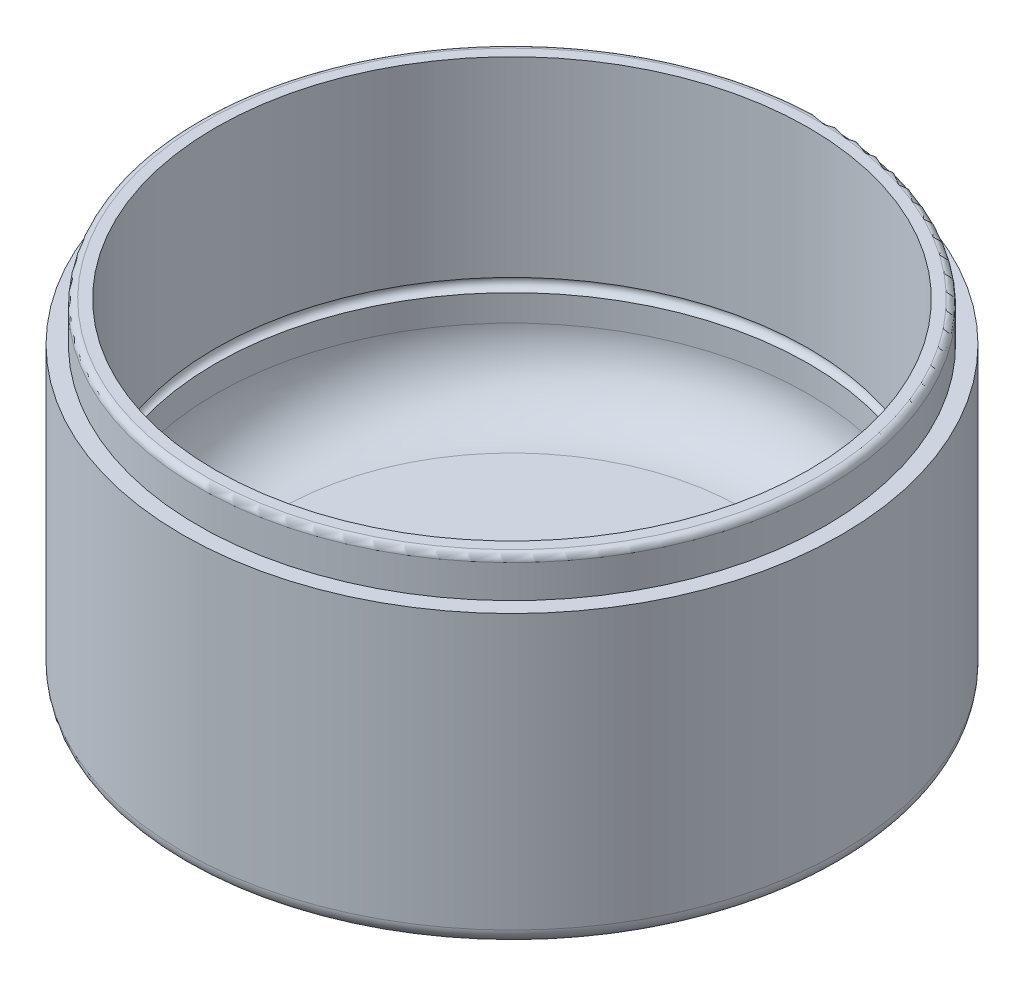
ISO-10303-21;
HEADER;
FILE_DESCRIPTION(('STEP AP214'),'2;1');
FILE_NAME('part.step','',(''),(''),'','','');
FILE_SCHEMA(('AUTOMOTIVE_DESIGN { 1 0 10303 214 1 1 1 1 }'));
ENDSEC;
DATA;
#1=APPLICATION_CONTEXT('core data for automotive mechanical design processes');
#2=APPLICATION_PROTOCOL_DEFINITION('international standard','automotive_design',2000,#1);
#3=PRODUCT_CONTEXT('',#1,'mechanical');
#4=PRODUCT('Part','Part','',(#3));
#5=PRODUCT_RELATED_PRODUCT_CATEGORY('part','',(#4));
#6=PRODUCT_DEFINITION_FORMATION('','',#4);
#7=PRODUCT_DEFINITION_CONTEXT('part definition',#1,'design');
#8=PRODUCT_DEFINITION('design','',#6,#7);
#9=PRODUCT_DEFINITION_SHAPE('','',#8);
#10=(LENGTH_UNIT() NAMED_UNIT(*) SI_UNIT(.MILLI.,.METRE.));
#11=(NAMED_UNIT(*) PLANE_ANGLE_UNIT() SI_UNIT($,.RADIAN.));
#12=(NAMED_UNIT(*) SI_UNIT($,.STERADIAN.) SOLID_ANGLE_UNIT());
#13=UNCERTAINTY_MEASURE_WITH_UNIT(LENGTH_MEASURE(1.E-05),#10,'distance_accuracy_value','');
#14=(GEOMETRIC_REPRESENTATION_CONTEXT(3) GLOBAL_UNCERTAINTY_ASSIGNED_CONTEXT((#13)) GLOBAL_UNIT_ASSIGNED_CONTEXT((#10,
#11,#12)) REPRESENTATION_CONTEXT('',''));
#15=CARTESIAN_POINT('',(0.,0.,0.));
#16=DIRECTION('',(0.,0.,1.));
#17=DIRECTION('',(1.,0.,0.));
#18=AXIS2_PLACEMENT_3D('',#15,#16,#17);
#19=CARTESIAN_POINT('',(0.,-50.,0.));
#20=DIRECTION('',(0.,1.,0.));
#21=DIRECTION('',(0.,0.,1.));
#22=AXIS2_PLACEMENT_3D('',#19,#20,#21);
#23=CYLINDRICAL_SURFACE('',#22,45.);
#24=CARTESIAN_POINT('',(0.,0.,0.));
#25=DIRECTION('',(0.,1.,0.));
#26=DIRECTION('',(0.,0.,1.));
#27=AXIS2_PLACEMENT_3D('',#24,#25,#26);
#28=CIRCLE('',#27,45.);
#29=CARTESIAN_POINT('',(0.,0.,45.));
#30=VERTEX_POINT('',#29);
#31=EDGE_CURVE('E91',#30,#30,#28,.T.);
#32=ORIENTED_EDGE('',*,*,#31,.T.);
#33=EDGE_LOOP('',(#32));
#34=FACE_BOUND('',#33,.T.);
#35=CARTESIAN_POINT('',(0.,-29.,0.));
#36=DIRECTION('',(0.,-1.,0.));
#37=DIRECTION('',(0.,0.,-1.));
#38=AXIS2_PLACEMENT_3D('',#35,#36,#37);
#39=CIRCLE('',#38,45.);
#40=CARTESIAN_POINT('',(45.,-29.,0.));
#41=VERTEX_POINT('',#40);
#42=EDGE_CURVE('E11',#41,#41,#39,.F.);
#43=ORIENTED_EDGE('',*,*,#42,.F.);
#44=EDGE_LOOP('',(#43));
#45=FACE_BOUND('',#44,.T.);
#46=ADVANCED_FACE('F45',(#34,#45),#23,.F.);
#47=CARTESIAN_POINT('',(0.,0.,0.));
#48=DIRECTION('',(0.,1.,0.));
#49=DIRECTION('',(0.,0.,1.));
#50=AXIS2_PLACEMENT_3D('',#47,#48,#49);
#51=PLANE('',#50);
#52=CARTESIAN_POINT('',(0.,0.,0.));
#53=DIRECTION('',(0.,1.,0.));
#54=DIRECTION('',(0.,0.,1.));
#55=AXIS2_PLACEMENT_3D('',#52,#53,#54);
#56=CIRCLE('',#55,46.6);
#57=CARTESIAN_POINT('',(46.6,0.,0.));
#58=VERTEX_POINT('',#57);
#59=EDGE_CURVE('E95',#58,#58,#56,.T.);
#60=ORIENTED_EDGE('',*,*,#59,.T.);
#61=EDGE_LOOP('',(#60));
#62=FACE_BOUND('',#61,.T.);
#63=ORIENTED_EDGE('',*,*,#31,.F.);
#64=EDGE_LOOP('',(#63));
#65=FACE_BOUND('',#64,.T.);
#66=ADVANCED_FACE('F126',(#62,#65),#51,.T.);
#67=CARTESIAN_POINT('',(0.,0.,0.));
#68=DIRECTION('',(0.,1.,0.));
#69=DIRECTION('',(0.,0.,1.));
#70=AXIS2_PLACEMENT_3D('',#67,#68,#69);
#71=CYLINDRICAL_SURFACE('',#70,47.6);
#72=DIRECTION('',(0.,-1.,0.));
#73=VECTOR('',#72,1.);
#74=CARTESIAN_POINT('',(47.6,0.,0.));
#75=LINE('',#74,#73);
#76=CARTESIAN_POINT('',(47.6,-1.,0.));
#77=VERTEX_POINT('',#76);
#78=CARTESIAN_POINT('',(47.6,-6.,0.));
#79=VERTEX_POINT('',#78);
#80=EDGE_CURVE('E76',#77,#79,#75,.T.);
#81=ORIENTED_EDGE('',*,*,#80,.F.);
#82=CARTESIAN_POINT('',(0.,-1.,0.));
#83=DIRECTION('',(0.,1.,0.));
#84=DIRECTION('',(0.,0.,1.));
#85=AXIS2_PLACEMENT_3D('',#82,#83,#84);
#86=CIRCLE('',#85,47.6);
#87=EDGE_CURVE('E81',#77,#77,#86,.F.);
#88=ORIENTED_EDGE('',*,*,#87,.T.);
#89=ORIENTED_EDGE('',*,*,#80,.T.);
#90=CARTESIAN_POINT('',(0.,-6.,0.));
#91=DIRECTION('',(0.,1.,0.));
#92=DIRECTION('',(1.,0.,0.));
#93=AXIS2_PLACEMENT_3D('',#90,#91,#92);
#94=CIRCLE('',#93,47.6);
#95=EDGE_CURVE('E79',#79,#79,#94,.T.);
#96=ORIENTED_EDGE('',*,*,#95,.T.);
#97=EDGE_LOOP('',(#81,#88,#89,#96));
#98=FACE_BOUND('',#97,.T.);
#99=ADVANCED_FACE('F77',(#98),#71,.T.);
#100=CARTESIAN_POINT('',(47.6,-6.,0.));
#101=DIRECTION('',(0.,1.,0.));
#102=DIRECTION('',(0.,0.,1.));
#103=AXIS2_PLACEMENT_3D('',#100,#101,#102);
#104=PLANE('',#103);
#105=CARTESIAN_POINT('',(0.,-6.,0.));
#106=DIRECTION('',(0.,1.,0.));
#107=DIRECTION('',(1.,0.,0.));
#108=AXIS2_PLACEMENT_3D('',#105,#106,#107);
#109=CIRCLE('',#108,50.);
#110=CARTESIAN_POINT('',(50.,-6.,0.));
#111=VERTEX_POINT('',#110);
#112=EDGE_CURVE('E85',#111,#111,#109,.T.);
#113=ORIENTED_EDGE('',*,*,#112,.T.);
#114=EDGE_LOOP('',(#113));
#115=FACE_BOUND('',#114,.T.);
#116=ORIENTED_EDGE('',*,*,#95,.F.);
#117=EDGE_LOOP('',(#116));
#118=FACE_BOUND('',#117,.T.);
#119=ADVANCED_FACE('F140',(#115,#118),#104,.T.);
#120=CARTESIAN_POINT('',(0.,-50.,0.));
#121=DIRECTION('',(0.,1.,0.));
#122=DIRECTION('',(0.,0.,1.));
#123=AXIS2_PLACEMENT_3D('',#120,#121,#122);
#124=PLANE('',#123);
#125=CARTESIAN_POINT('',(0.,-50.,0.));
#126=DIRECTION('',(0.,1.,0.));
#127=DIRECTION('',(0.,0.,1.));
#128=AXIS2_PLACEMENT_3D('',#125,#126,#127);
#129=CIRCLE('',#128,47.6);
#130=CARTESIAN_POINT('',(0.,-50.,47.6));
#131=VERTEX_POINT('',#130);
#132=EDGE_CURVE('E108',#131,#131,#129,.F.);
#133=ORIENTED_EDGE('',*,*,#132,.T.);
#134=EDGE_LOOP('',(#133));
#135=FACE_BOUND('',#134,.T.);
#136=ADVANCED_FACE('F144',(#135),#124,.F.);
#137=CARTESIAN_POINT('',(0.,-50.,0.));
#138=DIRECTION('',(0.,1.,0.));
#139=DIRECTION('',(0.,0.,1.));
#140=AXIS2_PLACEMENT_3D('',#137,#138,#139);
#141=CYLINDRICAL_SURFACE('',#140,50.);
#142=CARTESIAN_POINT('',(0.,-47.6,0.));
#143=DIRECTION('',(0.,1.,0.));
#144=DIRECTION('',(0.,0.,1.));
#145=AXIS2_PLACEMENT_3D('',#142,#143,#144);
#146=CIRCLE('',#145,50.);
#147=CARTESIAN_POINT('',(0.,-47.6,50.));
#148=VERTEX_POINT('',#147);
#149=EDGE_CURVE('E105',#148,#148,#146,.T.);
#150=ORIENTED_EDGE('',*,*,#149,.T.);
#151=EDGE_LOOP('',(#150));
#152=FACE_BOUND('',#151,.T.);
#153=ORIENTED_EDGE('',*,*,#112,.F.);
#154=EDGE_LOOP('',(#153));
#155=FACE_BOUND('',#154,.T.);
#156=ADVANCED_FACE('F145',(#152,#155),#141,.T.);
#157=CARTESIAN_POINT('',(0.,-1.,0.));
#158=DIRECTION('',(0.,1.,0.));
#159=DIRECTION('',(0.,0.,1.));
#160=AXIS2_PLACEMENT_3D('',#157,#158,#159);
#161=TOROIDAL_SURFACE('',#160,46.6,1.);
#162=CARTESIAN_POINT('',(46.6,-1.,0.));
#163=DIRECTION('',(0.,0.,1.));
#164=DIRECTION('',(1.,0.,0.));
#165=AXIS2_PLACEMENT_3D('',#162,#163,#164);
#166=CIRCLE('',#165,1.);
#167=EDGE_CURVE('E83',#77,#58,#166,.T.);
#168=ORIENTED_EDGE('',*,*,#167,.F.);
#169=ORIENTED_EDGE('',*,*,#87,.F.);
#170=ORIENTED_EDGE('',*,*,#167,.T.);
#171=ORIENTED_EDGE('',*,*,#59,.F.);
#172=EDGE_LOOP('',(#168,#169,#170,#171));
#173=FACE_BOUND('',#172,.T.);
#174=ADVANCED_FACE('F148',(#173),#161,.T.);
#175=CARTESIAN_POINT('',(0.,-47.6,0.));
#176=DIRECTION('',(0.,1.,0.));
#177=DIRECTION('',(0.,0.,1.));
#178=AXIS2_PLACEMENT_3D('',#175,#176,#177);
#179=TOROIDAL_SURFACE('',#178,47.6,2.4);
#180=ORIENTED_EDGE('',*,*,#132,.F.);
#181=EDGE_LOOP('',(#180));
#182=FACE_BOUND('',#181,.T.);
#183=ORIENTED_EDGE('',*,*,#149,.F.);
#184=EDGE_LOOP('',(#183));
#185=FACE_BOUND('',#184,.T.);
#186=ADVANCED_FACE('F47',(#182,#185),#179,.T.);
#187=CARTESIAN_POINT('',(0.,-30.,0.));
#188=DIRECTION('',(0.,1.,0.));
#189=DIRECTION('',(0.,0.,1.));
#190=AXIS2_PLACEMENT_3D('',#187,#188,#189);
#191=TOROIDAL_SURFACE('',#190,45.,0.999999999999998);
#192=ORIENTED_EDGE('',*,*,#42,.T.);
#193=CARTESIAN_POINT('',(45.,-30.,0.));
#194=DIRECTION('',(0.,0.,1.));
#195=DIRECTION('',(1.,0.,0.));
#196=AXIS2_PLACEMENT_3D('',#193,#194,#195);
#197=CIRCLE('',#196,0.999999999999998);
#198=CARTESIAN_POINT('',(45.,-31.,0.));
#199=VERTEX_POINT('',#198);
#200=EDGE_CURVE('E59',#199,#41,#197,.T.);
#201=ORIENTED_EDGE('',*,*,#200,.F.);
#202=CARTESIAN_POINT('',(0.,-31.,0.));
#203=DIRECTION('',(0.,1.,0.));
#204=DIRECTION('',(0.,0.,1.));
#205=AXIS2_PLACEMENT_3D('',#202,#203,#204);
#206=CIRCLE('',#205,45.);
#207=EDGE_CURVE('E53',#199,#199,#206,.F.);
#208=ORIENTED_EDGE('',*,*,#207,.T.);
#209=ORIENTED_EDGE('',*,*,#200,.T.);
#210=EDGE_LOOP('',(#192,#201,#208,#209));
#211=FACE_BOUND('',#210,.T.);
#212=ADVANCED_FACE('F111',(#211),#191,.F.);
#213=CARTESIAN_POINT('',(0.,-45.,0.));
#214=DIRECTION('',(0.,1.,0.));
#215=DIRECTION('',(0.,0.,1.));
#216=AXIS2_PLACEMENT_3D('',#213,#214,#215);
#217=PLANE('',#216);
#218=CARTESIAN_POINT('',(0.,-45.,0.));
#219=DIRECTION('',(0.,1.,0.));
#220=DIRECTION('',(0.,0.,1.));
#221=AXIS2_PLACEMENT_3D('',#218,#219,#220);
#222=CIRCLE('',#221,35.);
#223=CARTESIAN_POINT('',(0.,-45.,35.));
#224=VERTEX_POINT('',#223);
#225=EDGE_CURVE('E98',#224,#224,#222,.T.);
#226=ORIENTED_EDGE('',*,*,#225,.T.);
#227=EDGE_LOOP('',(#226));
#228=FACE_BOUND('',#227,.T.);
#229=ADVANCED_FACE('F121',(#228),#217,.T.);
#230=CARTESIAN_POINT('',(0.,-35.,0.));
#231=DIRECTION('',(0.,1.,0.));
#232=DIRECTION('',(0.,0.,1.));
#233=AXIS2_PLACEMENT_3D('',#230,#231,#232);
#234=TOROIDAL_SURFACE('',#233,35.,10.);
#235=CARTESIAN_POINT('',(0.,-35.,0.));
#236=DIRECTION('',(0.,1.,0.));
#237=DIRECTION('',(0.,0.,1.));
#238=AXIS2_PLACEMENT_3D('',#235,#236,#237);
#239=CIRCLE('',#238,45.);
#240=CARTESIAN_POINT('',(0.,-35.,45.));
#241=VERTEX_POINT('',#240);
#242=EDGE_CURVE('E102',#241,#241,#239,.F.);
#243=ORIENTED_EDGE('',*,*,#242,.F.);
#244=EDGE_LOOP('',(#243));
#245=FACE_BOUND('',#244,.T.);
#246=ORIENTED_EDGE('',*,*,#225,.F.);
#247=EDGE_LOOP('',(#246));
#248=FACE_BOUND('',#247,.T.);
#249=ADVANCED_FACE('F115',(#245,#248),#234,.F.);
#250=ORIENTED_EDGE('',*,*,#242,.T.);
#251=EDGE_LOOP('',(#250));
#252=FACE_BOUND('',#251,.T.);
#253=ORIENTED_EDGE('',*,*,#207,.F.);
#254=EDGE_LOOP('',(#253));
#255=FACE_BOUND('',#254,.T.);
#256=ADVANCED_FACE('F113',(#252,#255),#23,.F.);
#257=CLOSED_SHELL('',(#46,#66,#99,#119,#136,#156,#174,#186,#212,#229,#249,#256));
#258=MANIFOLD_SOLID_BREP('B2',#257);
#259=ADVANCED_BREP_SHAPE_REPRESENTATION('',(#18,#258),#14);
#260=SHAPE_DEFINITION_REPRESENTATION(#9,#259);
ENDSEC;
END-ISO-10303-21;
